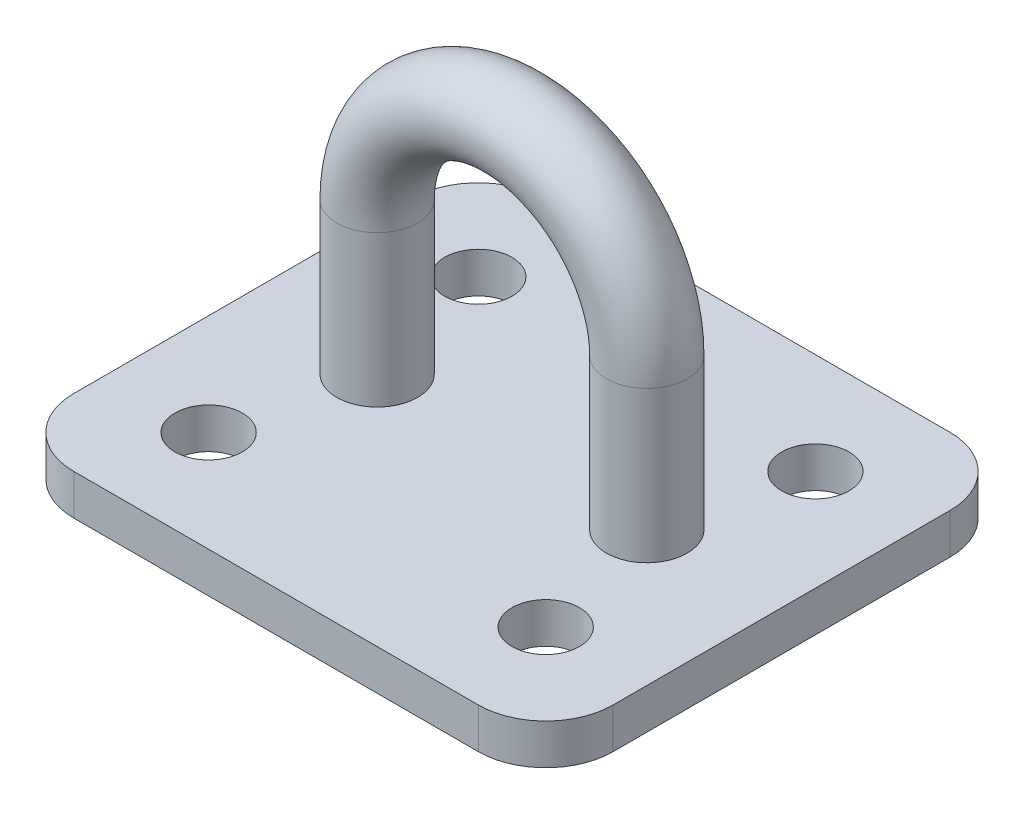
ISO-10303-21;
HEADER;
FILE_DESCRIPTION(('STEP AP214'),'2;1');
FILE_NAME('part.step','',(''),(''),'','','');
FILE_SCHEMA(('AUTOMOTIVE_DESIGN { 1 0 10303 214 1 1 1 1 }'));
ENDSEC;
DATA;
#1=APPLICATION_CONTEXT('core data for automotive mechanical design processes');
#2=APPLICATION_PROTOCOL_DEFINITION('international standard','automotive_design',2000,#1);
#3=PRODUCT_CONTEXT('',#1,'mechanical');
#4=PRODUCT('Part','Part','',(#3));
#5=PRODUCT_RELATED_PRODUCT_CATEGORY('part','',(#4));
#6=PRODUCT_DEFINITION_FORMATION('','',#4);
#7=PRODUCT_DEFINITION_CONTEXT('part definition',#1,'design');
#8=PRODUCT_DEFINITION('design','',#6,#7);
#9=PRODUCT_DEFINITION_SHAPE('','',#8);
#10=(LENGTH_UNIT() NAMED_UNIT(*) SI_UNIT(.MILLI.,.METRE.));
#11=(NAMED_UNIT(*) PLANE_ANGLE_UNIT() SI_UNIT($,.RADIAN.));
#12=(NAMED_UNIT(*) SI_UNIT($,.STERADIAN.) SOLID_ANGLE_UNIT());
#13=UNCERTAINTY_MEASURE_WITH_UNIT(LENGTH_MEASURE(1.E-05),#10,'distance_accuracy_value','');
#14=(GEOMETRIC_REPRESENTATION_CONTEXT(3) GLOBAL_UNCERTAINTY_ASSIGNED_CONTEXT((#13)) GLOBAL_UNIT_ASSIGNED_CONTEXT((#10,
#11,#12)) REPRESENTATION_CONTEXT('',''));
#15=CARTESIAN_POINT('',(0.,0.,0.));
#16=DIRECTION('',(0.,0.,1.));
#17=DIRECTION('',(1.,0.,0.));
#18=AXIS2_PLACEMENT_3D('',#15,#16,#17);
#19=CARTESIAN_POINT('',(-15.,3.,12.5));
#20=DIRECTION('',(0.,-1.,0.));
#21=DIRECTION('',(0.,0.,-1.));
#22=AXIS2_PLACEMENT_3D('',#19,#20,#21);
#23=PLANE('',#22);
#24=CARTESIAN_POINT('',(-10.,3.,0.));
#25=DIRECTION('',(0.,-1.,0.));
#26=DIRECTION('',(0.,0.,-1.));
#27=AXIS2_PLACEMENT_3D('',#24,#25,#26);
#28=CIRCLE('',#27,3.);
#29=CARTESIAN_POINT('',(-10.,3.,-3.));
#30=VERTEX_POINT('',#29);
#31=EDGE_CURVE('E241',#30,#30,#28,.T.);
#32=ORIENTED_EDGE('',*,*,#31,.T.);
#33=EDGE_LOOP('',(#32));
#34=FACE_BOUND('',#33,.T.);
#35=CARTESIAN_POINT('',(10.,3.,0.));
#36=DIRECTION('',(0.,-1.,0.));
#37=DIRECTION('',(0.,0.,-1.));
#38=AXIS2_PLACEMENT_3D('',#35,#36,#37);
#39=CIRCLE('',#38,3.);
#40=CARTESIAN_POINT('',(10.,3.,-3.));
#41=VERTEX_POINT('',#40);
#42=EDGE_CURVE('E248',#41,#41,#39,.T.);
#43=ORIENTED_EDGE('',*,*,#42,.T.);
#44=EDGE_LOOP('',(#43));
#45=FACE_BOUND('',#44,.T.);
#46=CARTESIAN_POINT('',(-15.,3.,12.5));
#47=DIRECTION('',(0.,1.,0.));
#48=DIRECTION('',(0.,0.,-1.));
#49=AXIS2_PLACEMENT_3D('',#46,#47,#48);
#50=CIRCLE('',#49,5.);
#51=CARTESIAN_POINT('',(-20.,3.,12.5));
#52=VERTEX_POINT('',#51);
#53=CARTESIAN_POINT('',(-15.,3.,17.5));
#54=VERTEX_POINT('',#53);
#55=EDGE_CURVE('E168',#52,#54,#50,.T.);
#56=ORIENTED_EDGE('',*,*,#55,.T.);
#57=DIRECTION('',(1.,0.,0.));
#58=VECTOR('',#57,1.);
#59=CARTESIAN_POINT('',(15.,3.,17.5));
#60=LINE('',#59,#58);
#61=CARTESIAN_POINT('',(15.,3.,17.5));
#62=VERTEX_POINT('',#61);
#63=EDGE_CURVE('E104',#54,#62,#60,.T.);
#64=ORIENTED_EDGE('',*,*,#63,.T.);
#65=CARTESIAN_POINT('',(15.,3.,12.5));
#66=DIRECTION('',(0.,1.,0.));
#67=DIRECTION('',(0.,0.,1.));
#68=AXIS2_PLACEMENT_3D('',#65,#66,#67);
#69=CIRCLE('',#68,5.);
#70=CARTESIAN_POINT('',(20.,3.,12.5));
#71=VERTEX_POINT('',#70);
#72=EDGE_CURVE('E189',#62,#71,#69,.T.);
#73=ORIENTED_EDGE('',*,*,#72,.T.);
#74=DIRECTION('',(0.,0.,-1.));
#75=VECTOR('',#74,1.);
#76=CARTESIAN_POINT('',(20.,3.,12.5));
#77=LINE('',#76,#75);
#78=CARTESIAN_POINT('',(20.,3.,-12.5));
#79=VERTEX_POINT('',#78);
#80=EDGE_CURVE('E203',#71,#79,#77,.T.);
#81=ORIENTED_EDGE('',*,*,#80,.T.);
#82=CARTESIAN_POINT('',(15.,3.,-12.5));
#83=DIRECTION('',(0.,1.,0.));
#84=DIRECTION('',(0.,0.,1.));
#85=AXIS2_PLACEMENT_3D('',#82,#83,#84);
#86=CIRCLE('',#85,5.);
#87=CARTESIAN_POINT('',(15.,3.,-17.5));
#88=VERTEX_POINT('',#87);
#89=EDGE_CURVE('E123',#79,#88,#86,.T.);
#90=ORIENTED_EDGE('',*,*,#89,.T.);
#91=DIRECTION('',(-1.,0.,0.));
#92=VECTOR('',#91,1.);
#93=CARTESIAN_POINT('',(15.,3.,-17.5));
#94=LINE('',#93,#92);
#95=CARTESIAN_POINT('',(-15.,3.,-17.5));
#96=VERTEX_POINT('',#95);
#97=EDGE_CURVE('E117',#88,#96,#94,.T.);
#98=ORIENTED_EDGE('',*,*,#97,.T.);
#99=CARTESIAN_POINT('',(-15.,3.,-12.5));
#100=DIRECTION('',(0.,1.,0.));
#101=DIRECTION('',(0.,0.,1.));
#102=AXIS2_PLACEMENT_3D('',#99,#100,#101);
#103=CIRCLE('',#102,5.);
#104=CARTESIAN_POINT('',(-20.,3.,-12.5));
#105=VERTEX_POINT('',#104);
#106=EDGE_CURVE('E121',#96,#105,#103,.T.);
#107=ORIENTED_EDGE('',*,*,#106,.T.);
#108=DIRECTION('',(0.,0.,1.));
#109=VECTOR('',#108,1.);
#110=CARTESIAN_POINT('',(-20.,3.,12.5));
#111=LINE('',#110,#109);
#112=EDGE_CURVE('E61',#105,#52,#111,.T.);
#113=ORIENTED_EDGE('',*,*,#112,.T.);
#114=EDGE_LOOP('',(#56,#64,#73,#81,#90,#98,#107,#113));
#115=FACE_BOUND('',#114,.T.);
#116=CARTESIAN_POINT('',(-12.5,3.,-10.));
#117=DIRECTION('',(0.,1.,0.));
#118=DIRECTION('',(0.,0.,1.));
#119=AXIS2_PLACEMENT_3D('',#116,#117,#118);
#120=CIRCLE('',#119,2.5);
#121=CARTESIAN_POINT('',(-12.5,3.,-7.5));
#122=VERTEX_POINT('',#121);
#123=EDGE_CURVE('E150',#122,#122,#120,.T.);
#124=ORIENTED_EDGE('',*,*,#123,.F.);
#125=EDGE_LOOP('',(#124));
#126=FACE_BOUND('',#125,.T.);
#127=CARTESIAN_POINT('',(12.5,3.,-10.));
#128=DIRECTION('',(0.,1.,0.));
#129=DIRECTION('',(0.,0.,1.));
#130=AXIS2_PLACEMENT_3D('',#127,#128,#129);
#131=CIRCLE('',#130,2.5);
#132=CARTESIAN_POINT('',(12.5,3.,-7.5));
#133=VERTEX_POINT('',#132);
#134=EDGE_CURVE('E217',#133,#133,#131,.T.);
#135=ORIENTED_EDGE('',*,*,#134,.F.);
#136=EDGE_LOOP('',(#135));
#137=FACE_BOUND('',#136,.T.);
#138=CARTESIAN_POINT('',(-12.5,3.,10.));
#139=DIRECTION('',(0.,1.,0.));
#140=DIRECTION('',(0.,0.,1.));
#141=AXIS2_PLACEMENT_3D('',#138,#139,#140);
#142=CIRCLE('',#141,2.5);
#143=CARTESIAN_POINT('',(-12.5,3.,12.5));
#144=VERTEX_POINT('',#143);
#145=EDGE_CURVE('E225',#144,#144,#142,.T.);
#146=ORIENTED_EDGE('',*,*,#145,.F.);
#147=EDGE_LOOP('',(#146));
#148=FACE_BOUND('',#147,.T.);
#149=CARTESIAN_POINT('',(12.5,3.,10.));
#150=DIRECTION('',(0.,1.,0.));
#151=DIRECTION('',(0.,0.,1.));
#152=AXIS2_PLACEMENT_3D('',#149,#150,#151);
#153=CIRCLE('',#152,2.5);
#154=CARTESIAN_POINT('',(12.5,3.,12.5));
#155=VERTEX_POINT('',#154);
#156=EDGE_CURVE('E233',#155,#155,#153,.T.);
#157=ORIENTED_EDGE('',*,*,#156,.F.);
#158=EDGE_LOOP('',(#157));
#159=FACE_BOUND('',#158,.T.);
#160=ADVANCED_FACE('F43',(#34,#45,#115,#126,#137,#148,#159),#23,.F.);
#161=CARTESIAN_POINT('',(-15.,0.,12.5));
#162=DIRECTION('',(0.,-1.,0.));
#163=DIRECTION('',(0.,0.,-1.));
#164=AXIS2_PLACEMENT_3D('',#161,#162,#163);
#165=PLANE('',#164);
#166=CARTESIAN_POINT('',(-12.5,0.,10.));
#167=DIRECTION('',(0.,1.,0.));
#168=DIRECTION('',(0.,0.,1.));
#169=AXIS2_PLACEMENT_3D('',#166,#167,#168);
#170=CIRCLE('',#169,2.5);
#171=CARTESIAN_POINT('',(-12.5,0.,12.5));
#172=VERTEX_POINT('',#171);
#173=EDGE_CURVE('E229',#172,#172,#170,.T.);
#174=ORIENTED_EDGE('',*,*,#173,.T.);
#175=EDGE_LOOP('',(#174));
#176=FACE_BOUND('',#175,.T.);
#177=CARTESIAN_POINT('',(-12.5,0.,-10.));
#178=DIRECTION('',(0.,1.,0.));
#179=DIRECTION('',(0.,0.,1.));
#180=AXIS2_PLACEMENT_3D('',#177,#178,#179);
#181=CIRCLE('',#180,2.5);
#182=CARTESIAN_POINT('',(-12.5,0.,-7.5));
#183=VERTEX_POINT('',#182);
#184=EDGE_CURVE('E213',#183,#183,#181,.T.);
#185=ORIENTED_EDGE('',*,*,#184,.T.);
#186=EDGE_LOOP('',(#185));
#187=FACE_BOUND('',#186,.T.);
#188=CARTESIAN_POINT('',(-15.,0.,12.5));
#189=DIRECTION('',(0.,1.,0.));
#190=DIRECTION('',(0.,0.,-1.));
#191=AXIS2_PLACEMENT_3D('',#188,#189,#190);
#192=CIRCLE('',#191,5.);
#193=CARTESIAN_POINT('',(-20.,0.,12.5));
#194=VERTEX_POINT('',#193);
#195=CARTESIAN_POINT('',(-15.,0.,17.5));
#196=VERTEX_POINT('',#195);
#197=EDGE_CURVE('E145',#194,#196,#192,.T.);
#198=ORIENTED_EDGE('',*,*,#197,.F.);
#199=DIRECTION('',(0.,0.,1.));
#200=VECTOR('',#199,1.);
#201=CARTESIAN_POINT('',(-20.,0.,12.5));
#202=LINE('',#201,#200);
#203=CARTESIAN_POINT('',(-20.,0.,-12.5));
#204=VERTEX_POINT('',#203);
#205=EDGE_CURVE('E96',#204,#194,#202,.T.);
#206=ORIENTED_EDGE('',*,*,#205,.F.);
#207=CARTESIAN_POINT('',(-15.,0.,-12.5));
#208=DIRECTION('',(0.,1.,0.));
#209=DIRECTION('',(0.,0.,1.));
#210=AXIS2_PLACEMENT_3D('',#207,#208,#209);
#211=CIRCLE('',#210,5.);
#212=CARTESIAN_POINT('',(-15.,0.,-17.5));
#213=VERTEX_POINT('',#212);
#214=EDGE_CURVE('E90',#213,#204,#211,.T.);
#215=ORIENTED_EDGE('',*,*,#214,.F.);
#216=DIRECTION('',(-1.,0.,0.));
#217=VECTOR('',#216,1.);
#218=CARTESIAN_POINT('',(15.,0.,-17.5));
#219=LINE('',#218,#217);
#220=CARTESIAN_POINT('',(15.,0.,-17.5));
#221=VERTEX_POINT('',#220);
#222=EDGE_CURVE('E132',#221,#213,#219,.T.);
#223=ORIENTED_EDGE('',*,*,#222,.F.);
#224=CARTESIAN_POINT('',(15.,0.,-12.5));
#225=DIRECTION('',(0.,1.,0.));
#226=DIRECTION('',(0.,0.,1.));
#227=AXIS2_PLACEMENT_3D('',#224,#225,#226);
#228=CIRCLE('',#227,5.);
#229=CARTESIAN_POINT('',(20.,0.,-12.5));
#230=VERTEX_POINT('',#229);
#231=EDGE_CURVE('E159',#230,#221,#228,.T.);
#232=ORIENTED_EDGE('',*,*,#231,.F.);
#233=DIRECTION('',(0.,0.,-1.));
#234=VECTOR('',#233,1.);
#235=CARTESIAN_POINT('',(20.,0.,12.5));
#236=LINE('',#235,#234);
#237=CARTESIAN_POINT('',(20.,0.,12.5));
#238=VERTEX_POINT('',#237);
#239=EDGE_CURVE('E156',#238,#230,#236,.T.);
#240=ORIENTED_EDGE('',*,*,#239,.F.);
#241=CARTESIAN_POINT('',(15.,0.,12.5));
#242=DIRECTION('',(0.,1.,0.));
#243=DIRECTION('',(0.,0.,1.));
#244=AXIS2_PLACEMENT_3D('',#241,#242,#243);
#245=CIRCLE('',#244,5.);
#246=CARTESIAN_POINT('',(15.,0.,17.5));
#247=VERTEX_POINT('',#246);
#248=EDGE_CURVE('E153',#247,#238,#245,.T.);
#249=ORIENTED_EDGE('',*,*,#248,.F.);
#250=DIRECTION('',(1.,0.,0.));
#251=VECTOR('',#250,1.);
#252=CARTESIAN_POINT('',(15.,0.,17.5));
#253=LINE('',#252,#251);
#254=EDGE_CURVE('E149',#196,#247,#253,.T.);
#255=ORIENTED_EDGE('',*,*,#254,.F.);
#256=EDGE_LOOP('',(#198,#206,#215,#223,#232,#240,#249,#255));
#257=FACE_BOUND('',#256,.T.);
#258=CARTESIAN_POINT('',(12.5,0.,-10.));
#259=DIRECTION('',(0.,1.,0.));
#260=DIRECTION('',(0.,0.,1.));
#261=AXIS2_PLACEMENT_3D('',#258,#259,#260);
#262=CIRCLE('',#261,2.5);
#263=CARTESIAN_POINT('',(12.5,0.,-7.5));
#264=VERTEX_POINT('',#263);
#265=EDGE_CURVE('E221',#264,#264,#262,.T.);
#266=ORIENTED_EDGE('',*,*,#265,.T.);
#267=EDGE_LOOP('',(#266));
#268=FACE_BOUND('',#267,.T.);
#269=CARTESIAN_POINT('',(12.5,0.,10.));
#270=DIRECTION('',(0.,1.,0.));
#271=DIRECTION('',(0.,0.,1.));
#272=AXIS2_PLACEMENT_3D('',#269,#270,#271);
#273=CIRCLE('',#272,2.5);
#274=CARTESIAN_POINT('',(12.5,0.,12.5));
#275=VERTEX_POINT('',#274);
#276=EDGE_CURVE('E237',#275,#275,#273,.T.);
#277=ORIENTED_EDGE('',*,*,#276,.T.);
#278=EDGE_LOOP('',(#277));
#279=FACE_BOUND('',#278,.T.);
#280=ADVANCED_FACE('F193',(#176,#187,#257,#268,#279),#165,.T.);
#281=CARTESIAN_POINT('',(-15.,3.,12.5));
#282=DIRECTION('',(0.,-1.,0.));
#283=DIRECTION('',(0.,0.,-1.));
#284=AXIS2_PLACEMENT_3D('',#281,#282,#283);
#285=CYLINDRICAL_SURFACE('',#284,5.);
#286=ORIENTED_EDGE('',*,*,#197,.T.);
#287=DIRECTION('',(0.,-1.,0.));
#288=VECTOR('',#287,1.);
#289=CARTESIAN_POINT('',(-15.,3.,17.5));
#290=LINE('',#289,#288);
#291=EDGE_CURVE('E11',#54,#196,#290,.T.);
#292=ORIENTED_EDGE('',*,*,#291,.F.);
#293=ORIENTED_EDGE('',*,*,#55,.F.);
#294=DIRECTION('',(0.,-1.,0.));
#295=VECTOR('',#294,1.);
#296=CARTESIAN_POINT('',(-20.,3.,12.5));
#297=LINE('',#296,#295);
#298=EDGE_CURVE('E141',#52,#194,#297,.T.);
#299=ORIENTED_EDGE('',*,*,#298,.T.);
#300=EDGE_LOOP('',(#286,#292,#293,#299));
#301=FACE_BOUND('',#300,.T.);
#302=ADVANCED_FACE('F45',(#301),#285,.T.);
#303=CARTESIAN_POINT('',(15.,3.,17.5));
#304=DIRECTION('',(0.,0.,-1.));
#305=DIRECTION('',(-1.,0.,0.));
#306=AXIS2_PLACEMENT_3D('',#303,#304,#305);
#307=PLANE('',#306);
#308=ORIENTED_EDGE('',*,*,#254,.T.);
#309=DIRECTION('',(0.,-1.,0.));
#310=VECTOR('',#309,1.);
#311=CARTESIAN_POINT('',(15.,3.,17.5));
#312=LINE('',#311,#310);
#313=EDGE_CURVE('E53',#62,#247,#312,.T.);
#314=ORIENTED_EDGE('',*,*,#313,.F.);
#315=ORIENTED_EDGE('',*,*,#63,.F.);
#316=ORIENTED_EDGE('',*,*,#291,.T.);
#317=EDGE_LOOP('',(#308,#314,#315,#316));
#318=FACE_BOUND('',#317,.T.);
#319=ADVANCED_FACE('F315',(#318),#307,.F.);
#320=CARTESIAN_POINT('',(15.,3.,12.5));
#321=DIRECTION('',(0.,-1.,0.));
#322=DIRECTION('',(0.,0.,-1.));
#323=AXIS2_PLACEMENT_3D('',#320,#321,#322);
#324=CYLINDRICAL_SURFACE('',#323,5.);
#325=ORIENTED_EDGE('',*,*,#248,.T.);
#326=DIRECTION('',(0.,-1.,0.));
#327=VECTOR('',#326,1.);
#328=CARTESIAN_POINT('',(20.,3.,12.5));
#329=LINE('',#328,#327);
#330=EDGE_CURVE('E179',#71,#238,#329,.T.);
#331=ORIENTED_EDGE('',*,*,#330,.F.);
#332=ORIENTED_EDGE('',*,*,#72,.F.);
#333=ORIENTED_EDGE('',*,*,#313,.T.);
#334=EDGE_LOOP('',(#325,#331,#332,#333));
#335=FACE_BOUND('',#334,.T.);
#336=ADVANCED_FACE('F187',(#335),#324,.T.);
#337=CARTESIAN_POINT('',(20.,3.,12.5));
#338=DIRECTION('',(-1.,0.,0.));
#339=DIRECTION('',(0.,0.,1.));
#340=AXIS2_PLACEMENT_3D('',#337,#338,#339);
#341=PLANE('',#340);
#342=ORIENTED_EDGE('',*,*,#239,.T.);
#343=DIRECTION('',(0.,-1.,0.));
#344=VECTOR('',#343,1.);
#345=CARTESIAN_POINT('',(20.,3.,-12.5));
#346=LINE('',#345,#344);
#347=EDGE_CURVE('E175',#79,#230,#346,.T.);
#348=ORIENTED_EDGE('',*,*,#347,.F.);
#349=ORIENTED_EDGE('',*,*,#80,.F.);
#350=ORIENTED_EDGE('',*,*,#330,.T.);
#351=EDGE_LOOP('',(#342,#348,#349,#350));
#352=FACE_BOUND('',#351,.T.);
#353=ADVANCED_FACE('F198',(#352),#341,.F.);
#354=CARTESIAN_POINT('',(15.,3.,-12.5));
#355=DIRECTION('',(0.,-1.,0.));
#356=DIRECTION('',(0.,0.,-1.));
#357=AXIS2_PLACEMENT_3D('',#354,#355,#356);
#358=CYLINDRICAL_SURFACE('',#357,5.);
#359=ORIENTED_EDGE('',*,*,#231,.T.);
#360=DIRECTION('',(0.,-1.,0.));
#361=VECTOR('',#360,1.);
#362=CARTESIAN_POINT('',(15.,3.,-17.5));
#363=LINE('',#362,#361);
#364=EDGE_CURVE('E134',#88,#221,#363,.T.);
#365=ORIENTED_EDGE('',*,*,#364,.F.);
#366=ORIENTED_EDGE('',*,*,#89,.F.);
#367=ORIENTED_EDGE('',*,*,#347,.T.);
#368=EDGE_LOOP('',(#359,#365,#366,#367));
#369=FACE_BOUND('',#368,.T.);
#370=ADVANCED_FACE('F201',(#369),#358,.T.);
#371=CARTESIAN_POINT('',(15.,3.,-17.5));
#372=DIRECTION('',(0.,0.,1.));
#373=DIRECTION('',(1.,0.,0.));
#374=AXIS2_PLACEMENT_3D('',#371,#372,#373);
#375=PLANE('',#374);
#376=ORIENTED_EDGE('',*,*,#222,.T.);
#377=DIRECTION('',(0.,-1.,0.));
#378=VECTOR('',#377,1.);
#379=CARTESIAN_POINT('',(-15.,3.,-17.5));
#380=LINE('',#379,#378);
#381=EDGE_CURVE('E129',#96,#213,#380,.T.);
#382=ORIENTED_EDGE('',*,*,#381,.F.);
#383=ORIENTED_EDGE('',*,*,#97,.F.);
#384=ORIENTED_EDGE('',*,*,#364,.T.);
#385=EDGE_LOOP('',(#376,#382,#383,#384));
#386=FACE_BOUND('',#385,.T.);
#387=ADVANCED_FACE('F130',(#386),#375,.F.);
#388=CARTESIAN_POINT('',(-15.,3.,-12.5));
#389=DIRECTION('',(0.,-1.,0.));
#390=DIRECTION('',(0.,0.,-1.));
#391=AXIS2_PLACEMENT_3D('',#388,#389,#390);
#392=CYLINDRICAL_SURFACE('',#391,5.);
#393=ORIENTED_EDGE('',*,*,#214,.T.);
#394=DIRECTION('',(0.,-1.,0.));
#395=VECTOR('',#394,1.);
#396=CARTESIAN_POINT('',(-20.,3.,-12.5));
#397=LINE('',#396,#395);
#398=EDGE_CURVE('E135',#105,#204,#397,.T.);
#399=ORIENTED_EDGE('',*,*,#398,.F.);
#400=ORIENTED_EDGE('',*,*,#106,.F.);
#401=ORIENTED_EDGE('',*,*,#381,.T.);
#402=EDGE_LOOP('',(#393,#399,#400,#401));
#403=FACE_BOUND('',#402,.T.);
#404=ADVANCED_FACE('F137',(#403),#392,.T.);
#405=CARTESIAN_POINT('',(-20.,3.,12.5));
#406=DIRECTION('',(1.,0.,0.));
#407=DIRECTION('',(0.,0.,-1.));
#408=AXIS2_PLACEMENT_3D('',#405,#406,#407);
#409=PLANE('',#408);
#410=ORIENTED_EDGE('',*,*,#205,.T.);
#411=ORIENTED_EDGE('',*,*,#298,.F.);
#412=ORIENTED_EDGE('',*,*,#112,.F.);
#413=ORIENTED_EDGE('',*,*,#398,.T.);
#414=EDGE_LOOP('',(#410,#411,#412,#413));
#415=FACE_BOUND('',#414,.T.);
#416=ADVANCED_FACE('F298',(#415),#409,.F.);
#417=CARTESIAN_POINT('',(-12.5,3.,-10.));
#418=DIRECTION('',(0.,-1.,0.));
#419=DIRECTION('',(0.,0.,-1.));
#420=AXIS2_PLACEMENT_3D('',#417,#418,#419);
#421=CYLINDRICAL_SURFACE('',#420,2.5);
#422=ORIENTED_EDGE('',*,*,#123,.T.);
#423=EDGE_LOOP('',(#422));
#424=FACE_BOUND('',#423,.T.);
#425=ORIENTED_EDGE('',*,*,#184,.F.);
#426=EDGE_LOOP('',(#425));
#427=FACE_BOUND('',#426,.T.);
#428=ADVANCED_FACE('F295',(#424,#427),#421,.F.);
#429=CARTESIAN_POINT('',(12.5,3.,-10.));
#430=DIRECTION('',(0.,-1.,0.));
#431=DIRECTION('',(0.,0.,-1.));
#432=AXIS2_PLACEMENT_3D('',#429,#430,#431);
#433=CYLINDRICAL_SURFACE('',#432,2.5);
#434=ORIENTED_EDGE('',*,*,#134,.T.);
#435=EDGE_LOOP('',(#434));
#436=FACE_BOUND('',#435,.T.);
#437=ORIENTED_EDGE('',*,*,#265,.F.);
#438=EDGE_LOOP('',(#437));
#439=FACE_BOUND('',#438,.T.);
#440=ADVANCED_FACE('F291',(#436,#439),#433,.F.);
#441=CARTESIAN_POINT('',(-12.5,3.,10.));
#442=DIRECTION('',(0.,-1.,0.));
#443=DIRECTION('',(0.,0.,-1.));
#444=AXIS2_PLACEMENT_3D('',#441,#442,#443);
#445=CYLINDRICAL_SURFACE('',#444,2.5);
#446=ORIENTED_EDGE('',*,*,#145,.T.);
#447=EDGE_LOOP('',(#446));
#448=FACE_BOUND('',#447,.T.);
#449=ORIENTED_EDGE('',*,*,#173,.F.);
#450=EDGE_LOOP('',(#449));
#451=FACE_BOUND('',#450,.T.);
#452=ADVANCED_FACE('F287',(#448,#451),#445,.F.);
#453=CARTESIAN_POINT('',(12.5,3.,10.));
#454=DIRECTION('',(0.,-1.,0.));
#455=DIRECTION('',(0.,0.,-1.));
#456=AXIS2_PLACEMENT_3D('',#453,#454,#455);
#457=CYLINDRICAL_SURFACE('',#456,2.5);
#458=ORIENTED_EDGE('',*,*,#156,.T.);
#459=EDGE_LOOP('',(#458));
#460=FACE_BOUND('',#459,.T.);
#461=ORIENTED_EDGE('',*,*,#276,.F.);
#462=EDGE_LOOP('',(#461));
#463=FACE_BOUND('',#462,.T.);
#464=ADVANCED_FACE('F267',(#460,#463),#457,.F.);
#465=CARTESIAN_POINT('',(-10.,0.,0.));
#466=DIRECTION('',(0.,1.,0.));
#467=DIRECTION('',(-1.,0.,0.));
#468=AXIS2_PLACEMENT_3D('',#465,#466,#467);
#469=CYLINDRICAL_SURFACE('',#468,3.);
#470=CARTESIAN_POINT('',(-10.,14.2,0.));
#471=DIRECTION('',(0.,1.,0.));
#472=DIRECTION('',(0.,0.,1.));
#473=AXIS2_PLACEMENT_3D('',#470,#471,#472);
#474=CIRCLE('',#473,3.);
#475=CARTESIAN_POINT('',(-13.,14.2,0.));
#476=VERTEX_POINT('',#475);
#477=EDGE_CURVE('E256',#476,#476,#474,.T.);
#478=ORIENTED_EDGE('',*,*,#477,.F.);
#479=EDGE_LOOP('',(#478));
#480=FACE_BOUND('',#479,.T.);
#481=ORIENTED_EDGE('',*,*,#31,.F.);
#482=EDGE_LOOP('',(#481));
#483=FACE_BOUND('',#482,.T.);
#484=ADVANCED_FACE('F263',(#480,#483),#469,.T.);
#485=CARTESIAN_POINT('',(10.,14.2,0.));
#486=DIRECTION('',(0.,-1.,0.));
#487=DIRECTION('',(1.,0.,0.));
#488=AXIS2_PLACEMENT_3D('',#485,#486,#487);
#489=CYLINDRICAL_SURFACE('',#488,3.);
#490=CARTESIAN_POINT('',(10.,14.2,0.));
#491=DIRECTION('',(0.,-1.,0.));
#492=DIRECTION('',(0.,0.,1.));
#493=AXIS2_PLACEMENT_3D('',#490,#491,#492);
#494=CIRCLE('',#493,3.);
#495=CARTESIAN_POINT('',(13.,14.2,0.));
#496=VERTEX_POINT('',#495);
#497=EDGE_CURVE('E252',#496,#496,#494,.T.);
#498=ORIENTED_EDGE('',*,*,#497,.T.);
#499=EDGE_LOOP('',(#498));
#500=FACE_BOUND('',#499,.T.);
#501=ORIENTED_EDGE('',*,*,#42,.F.);
#502=EDGE_LOOP('',(#501));
#503=FACE_BOUND('',#502,.T.);
#504=ADVANCED_FACE('F266',(#500,#503),#489,.T.);
#505=CARTESIAN_POINT('',(0.,14.2,0.));
#506=DIRECTION('',(0.,0.,-1.));
#507=DIRECTION('',(-1.,0.,0.));
#508=AXIS2_PLACEMENT_3D('',#505,#506,#507);
#509=TOROIDAL_SURFACE('',#508,10.,3.);
#510=CARTESIAN_POINT('',(0.,14.2,0.));
#511=DIRECTION('',(0.,0.,-1.));
#512=DIRECTION('',(-1.,0.,0.));
#513=AXIS2_PLACEMENT_3D('',#510,#511,#512);
#514=CIRCLE('',#513,13.);
#515=EDGE_CURVE('',#476,#496,#514,.T.);
#516=ORIENTED_EDGE('',*,*,#477,.T.);
#517=ORIENTED_EDGE('',*,*,#497,.F.);
#518=ORIENTED_EDGE('',*,*,#515,.T.);
#519=ORIENTED_EDGE('',*,*,#515,.F.);
#520=EDGE_LOOP('',(#516,#518,#517,#519));
#521=FACE_BOUND('',#520,.T.);
#522=ADVANCED_FACE('F261',(#521),#509,.T.);
#523=CLOSED_SHELL('',(#160,#280,#302,#319,#336,#353,#370,#387,#404,#416,#428,#440,#452,#464,
#484,#504,#522));
#524=MANIFOLD_SOLID_BREP('B2',#523);
#525=ADVANCED_BREP_SHAPE_REPRESENTATION('',(#18,#524),#14);
#526=SHAPE_DEFINITION_REPRESENTATION(#9,#525);
ENDSEC;
END-ISO-10303-21;
